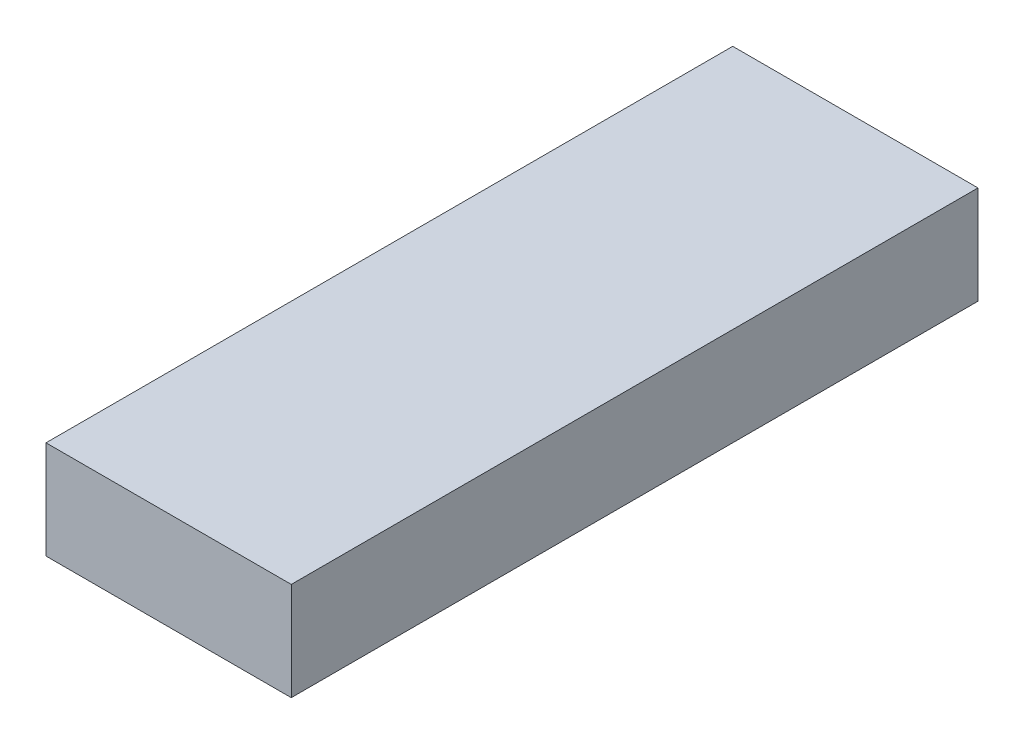
ISO-10303-21;
HEADER;
FILE_DESCRIPTION(('STEP AP214'),'2;1');
FILE_NAME('part.step','',(''),(''),'','','');
FILE_SCHEMA(('AUTOMOTIVE_DESIGN { 1 0 10303 214 1 1 1 1 }'));
ENDSEC;
DATA;
#1=APPLICATION_CONTEXT('core data for automotive mechanical design processes');
#2=APPLICATION_PROTOCOL_DEFINITION('international standard','automotive_design',2000,#1);
#3=PRODUCT_CONTEXT('',#1,'mechanical');
#4=PRODUCT('Part','Part','',(#3));
#5=PRODUCT_RELATED_PRODUCT_CATEGORY('part','',(#4));
#6=PRODUCT_DEFINITION_FORMATION('','',#4);
#7=PRODUCT_DEFINITION_CONTEXT('part definition',#1,'design');
#8=PRODUCT_DEFINITION('design','',#6,#7);
#9=PRODUCT_DEFINITION_SHAPE('','',#8);
#10=(LENGTH_UNIT() NAMED_UNIT(*) SI_UNIT(.MILLI.,.METRE.));
#11=(NAMED_UNIT(*) PLANE_ANGLE_UNIT() SI_UNIT($,.RADIAN.));
#12=(NAMED_UNIT(*) SI_UNIT($,.STERADIAN.) SOLID_ANGLE_UNIT());
#13=UNCERTAINTY_MEASURE_WITH_UNIT(LENGTH_MEASURE(1.E-05),#10,'distance_accuracy_value','');
#14=(GEOMETRIC_REPRESENTATION_CONTEXT(3) GLOBAL_UNCERTAINTY_ASSIGNED_CONTEXT((#13)) GLOBAL_UNIT_ASSIGNED_CONTEXT((#10,
#11,#12)) REPRESENTATION_CONTEXT('',''));
#15=CARTESIAN_POINT('',(0.,0.,0.));
#16=DIRECTION('',(0.,0.,1.));
#17=DIRECTION('',(1.,0.,0.));
#18=AXIS2_PLACEMENT_3D('',#15,#16,#17);
#19=CARTESIAN_POINT('',(-12.5,10.,35.));
#20=DIRECTION('',(1.,0.,0.));
#21=DIRECTION('',(0.,0.,-1.));
#22=AXIS2_PLACEMENT_3D('',#19,#20,#21);
#23=PLANE('',#22);
#24=DIRECTION('',(0.,0.,1.));
#25=VECTOR('',#24,1.);
#26=CARTESIAN_POINT('',(-12.5,0.,35.));
#27=LINE('',#26,#25);
#28=CARTESIAN_POINT('',(-12.5,0.,-35.));
#29=VERTEX_POINT('',#28);
#30=CARTESIAN_POINT('',(-12.5,0.,35.));
#31=VERTEX_POINT('',#30);
#32=EDGE_CURVE('E102',#29,#31,#27,.T.);
#33=ORIENTED_EDGE('',*,*,#32,.T.);
#34=DIRECTION('',(0.,-1.,0.));
#35=VECTOR('',#34,1.);
#36=CARTESIAN_POINT('',(-12.5,10.,35.));
#37=LINE('',#36,#35);
#38=CARTESIAN_POINT('',(-12.5,10.,35.));
#39=VERTEX_POINT('',#38);
#40=EDGE_CURVE('E11',#39,#31,#37,.T.);
#41=ORIENTED_EDGE('',*,*,#40,.F.);
#42=DIRECTION('',(0.,0.,1.));
#43=VECTOR('',#42,1.);
#44=CARTESIAN_POINT('',(-12.5,10.,35.));
#45=LINE('',#44,#43);
#46=CARTESIAN_POINT('',(-12.5,10.,-35.));
#47=VERTEX_POINT('',#46);
#48=EDGE_CURVE('E90',#47,#39,#45,.T.);
#49=ORIENTED_EDGE('',*,*,#48,.F.);
#50=DIRECTION('',(0.,-1.,0.));
#51=VECTOR('',#50,1.);
#52=CARTESIAN_POINT('',(-12.5,10.,-35.));
#53=LINE('',#52,#51);
#54=EDGE_CURVE('E98',#47,#29,#53,.T.);
#55=ORIENTED_EDGE('',*,*,#54,.T.);
#56=EDGE_LOOP('',(#33,#41,#49,#55));
#57=FACE_BOUND('',#56,.T.);
#58=ADVANCED_FACE('F39',(#57),#23,.F.);
#59=CARTESIAN_POINT('',(12.5,10.,35.));
#60=DIRECTION('',(0.,0.,-1.));
#61=DIRECTION('',(-1.,0.,0.));
#62=AXIS2_PLACEMENT_3D('',#59,#60,#61);
#63=PLANE('',#62);
#64=DIRECTION('',(1.,0.,0.));
#65=VECTOR('',#64,1.);
#66=CARTESIAN_POINT('',(12.5,0.,35.));
#67=LINE('',#66,#65);
#68=CARTESIAN_POINT('',(12.5,0.,35.));
#69=VERTEX_POINT('',#68);
#70=EDGE_CURVE('E94',#31,#69,#67,.T.);
#71=ORIENTED_EDGE('',*,*,#70,.T.);
#72=DIRECTION('',(0.,-1.,0.));
#73=VECTOR('',#72,1.);
#74=CARTESIAN_POINT('',(12.5,10.,35.));
#75=LINE('',#74,#73);
#76=CARTESIAN_POINT('',(12.5,10.,35.));
#77=VERTEX_POINT('',#76);
#78=EDGE_CURVE('E47',#77,#69,#75,.T.);
#79=ORIENTED_EDGE('',*,*,#78,.F.);
#80=DIRECTION('',(1.,0.,0.));
#81=VECTOR('',#80,1.);
#82=CARTESIAN_POINT('',(12.5,10.,35.));
#83=LINE('',#82,#81);
#84=EDGE_CURVE('E85',#39,#77,#83,.T.);
#85=ORIENTED_EDGE('',*,*,#84,.F.);
#86=ORIENTED_EDGE('',*,*,#40,.T.);
#87=EDGE_LOOP('',(#71,#79,#85,#86));
#88=FACE_BOUND('',#87,.T.);
#89=ADVANCED_FACE('F93',(#88),#63,.F.);
#90=CARTESIAN_POINT('',(12.5,10.,35.));
#91=DIRECTION('',(-1.,0.,0.));
#92=DIRECTION('',(0.,0.,1.));
#93=AXIS2_PLACEMENT_3D('',#90,#91,#92);
#94=PLANE('',#93);
#95=DIRECTION('',(0.,0.,-1.));
#96=VECTOR('',#95,1.);
#97=CARTESIAN_POINT('',(12.5,0.,35.));
#98=LINE('',#97,#96);
#99=CARTESIAN_POINT('',(12.5,0.,-35.));
#100=VERTEX_POINT('',#99);
#101=EDGE_CURVE('E72',#69,#100,#98,.T.);
#102=ORIENTED_EDGE('',*,*,#101,.T.);
#103=DIRECTION('',(0.,-1.,0.));
#104=VECTOR('',#103,1.);
#105=CARTESIAN_POINT('',(12.5,10.,-35.));
#106=LINE('',#105,#104);
#107=CARTESIAN_POINT('',(12.5,10.,-35.));
#108=VERTEX_POINT('',#107);
#109=EDGE_CURVE('E95',#108,#100,#106,.T.);
#110=ORIENTED_EDGE('',*,*,#109,.F.);
#111=DIRECTION('',(0.,0.,-1.));
#112=VECTOR('',#111,1.);
#113=CARTESIAN_POINT('',(12.5,10.,35.));
#114=LINE('',#113,#112);
#115=EDGE_CURVE('E88',#77,#108,#114,.T.);
#116=ORIENTED_EDGE('',*,*,#115,.F.);
#117=ORIENTED_EDGE('',*,*,#78,.T.);
#118=EDGE_LOOP('',(#102,#110,#116,#117));
#119=FACE_BOUND('',#118,.T.);
#120=ADVANCED_FACE('F96',(#119),#94,.F.);
#121=CARTESIAN_POINT('',(12.5,10.,-35.));
#122=DIRECTION('',(0.,0.,1.));
#123=DIRECTION('',(1.,0.,0.));
#124=AXIS2_PLACEMENT_3D('',#121,#122,#123);
#125=PLANE('',#124);
#126=DIRECTION('',(-1.,0.,0.));
#127=VECTOR('',#126,1.);
#128=CARTESIAN_POINT('',(12.5,0.,-35.));
#129=LINE('',#128,#127);
#130=EDGE_CURVE('E78',#100,#29,#129,.T.);
#131=ORIENTED_EDGE('',*,*,#130,.T.);
#132=ORIENTED_EDGE('',*,*,#54,.F.);
#133=DIRECTION('',(-1.,0.,0.));
#134=VECTOR('',#133,1.);
#135=CARTESIAN_POINT('',(12.5,10.,-35.));
#136=LINE('',#135,#134);
#137=EDGE_CURVE('E55',#108,#47,#136,.T.);
#138=ORIENTED_EDGE('',*,*,#137,.F.);
#139=ORIENTED_EDGE('',*,*,#109,.T.);
#140=EDGE_LOOP('',(#131,#132,#138,#139));
#141=FACE_BOUND('',#140,.T.);
#142=ADVANCED_FACE('F109',(#141),#125,.F.);
#143=CARTESIAN_POINT('',(0.,10.,0.));
#144=DIRECTION('',(0.,1.,0.));
#145=DIRECTION('',(0.,0.,1.));
#146=AXIS2_PLACEMENT_3D('',#143,#144,#145);
#147=PLANE('',#146);
#148=ORIENTED_EDGE('',*,*,#48,.T.);
#149=ORIENTED_EDGE('',*,*,#84,.T.);
#150=ORIENTED_EDGE('',*,*,#115,.T.);
#151=ORIENTED_EDGE('',*,*,#137,.T.);
#152=EDGE_LOOP('',(#148,#149,#150,#151));
#153=FACE_BOUND('',#152,.T.);
#154=ADVANCED_FACE('F86',(#153),#147,.T.);
#155=CARTESIAN_POINT('',(0.,0.,0.));
#156=DIRECTION('',(0.,1.,0.));
#157=DIRECTION('',(0.,0.,1.));
#158=AXIS2_PLACEMENT_3D('',#155,#156,#157);
#159=PLANE('',#158);
#160=ORIENTED_EDGE('',*,*,#32,.F.);
#161=ORIENTED_EDGE('',*,*,#130,.F.);
#162=ORIENTED_EDGE('',*,*,#101,.F.);
#163=ORIENTED_EDGE('',*,*,#70,.F.);
#164=EDGE_LOOP('',(#160,#161,#162,#163));
#165=FACE_BOUND('',#164,.T.);
#166=ADVANCED_FACE('F112',(#165),#159,.F.);
#167=CLOSED_SHELL('',(#58,#89,#120,#142,#154,#166));
#168=MANIFOLD_SOLID_BREP('B2',#167);
#169=ADVANCED_BREP_SHAPE_REPRESENTATION('',(#18,#168),#14);
#170=SHAPE_DEFINITION_REPRESENTATION(#9,#169);
ENDSEC;
END-ISO-10303-21;
